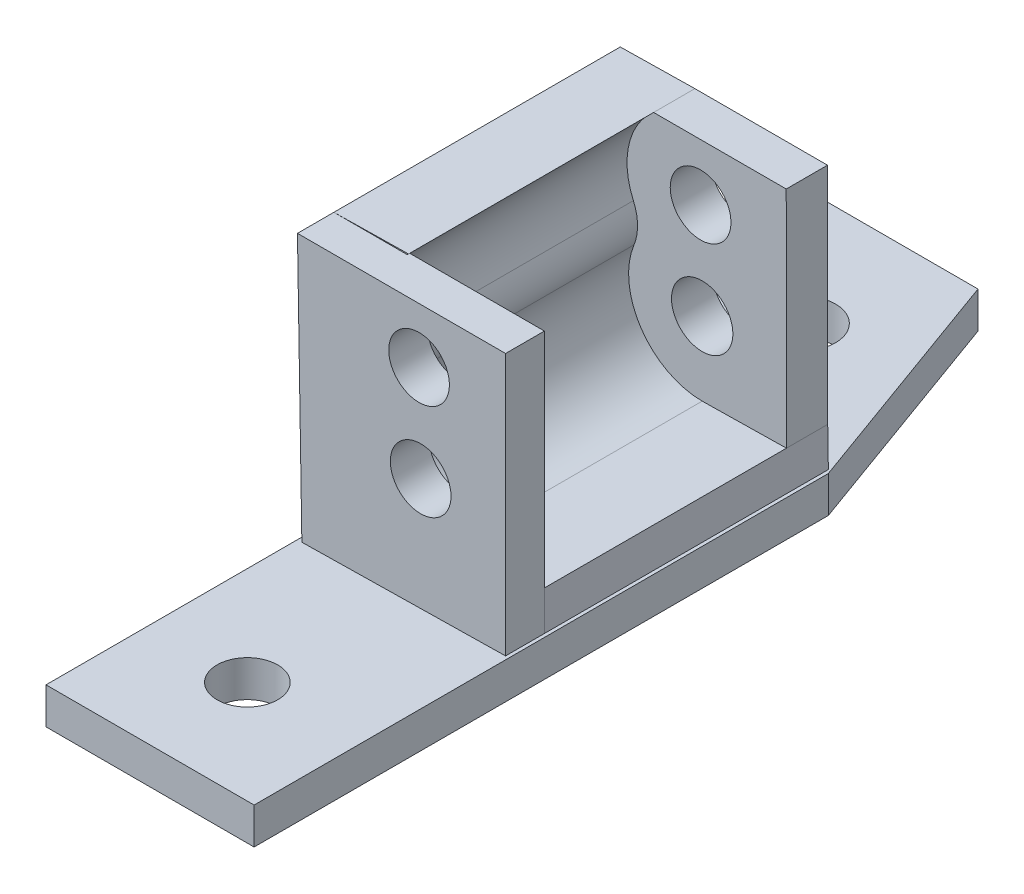
ISO-10303-21;
HEADER;
FILE_DESCRIPTION(('STEP AP214'),'2;1');
FILE_NAME('part.step','',(''),(''),'','','');
FILE_SCHEMA(('AUTOMOTIVE_DESIGN { 1 0 10303 214 1 1 1 1 }'));
ENDSEC;
DATA;
#1=APPLICATION_CONTEXT('core data for automotive mechanical design processes');
#2=APPLICATION_PROTOCOL_DEFINITION('international standard','automotive_design',2000,#1);
#3=PRODUCT_CONTEXT('',#1,'mechanical');
#4=PRODUCT('Part','Part','',(#3));
#5=PRODUCT_RELATED_PRODUCT_CATEGORY('part','',(#4));
#6=PRODUCT_DEFINITION_FORMATION('','',#4);
#7=PRODUCT_DEFINITION_CONTEXT('part definition',#1,'design');
#8=PRODUCT_DEFINITION('design','',#6,#7);
#9=PRODUCT_DEFINITION_SHAPE('','',#8);
#10=(LENGTH_UNIT() NAMED_UNIT(*) SI_UNIT(.MILLI.,.METRE.));
#11=(NAMED_UNIT(*) PLANE_ANGLE_UNIT() SI_UNIT($,.RADIAN.));
#12=(NAMED_UNIT(*) SI_UNIT($,.STERADIAN.) SOLID_ANGLE_UNIT());
#13=UNCERTAINTY_MEASURE_WITH_UNIT(LENGTH_MEASURE(1.E-05),#10,'distance_accuracy_value','');
#14=(GEOMETRIC_REPRESENTATION_CONTEXT(3) GLOBAL_UNCERTAINTY_ASSIGNED_CONTEXT((#13)) GLOBAL_UNIT_ASSIGNED_CONTEXT((#10,
#11,#12)) REPRESENTATION_CONTEXT('',''));
#15=CARTESIAN_POINT('',(0.,0.,0.));
#16=DIRECTION('',(0.,0.,1.));
#17=DIRECTION('',(1.,0.,0.));
#18=AXIS2_PLACEMENT_3D('',#15,#16,#17);
#19=CARTESIAN_POINT('',(-428.281622723484,104.714397362417,3.22006910734274E-13));
#20=DIRECTION('',(-0.999999992718876,0.00012067413737197,0.));
#21=DIRECTION('',(-0.00012067413737197,-0.999999992718876,0.));
#22=AXIS2_PLACEMENT_3D('',#19,#20,#21);
#23=PLANE('',#22);
#24=DIRECTION('',(0.,0.,1.));
#25=VECTOR('',#24,1.);
#26=CARTESIAN_POINT('',(-428.281162955021,108.524397334676,3.33536171392683E-13));
#27=LINE('',#26,#25);
#28=CARTESIAN_POINT('',(-428.281162955021,108.524397334676,-29.9720000000001));
#29=VERTEX_POINT('',#28);
#30=CARTESIAN_POINT('',(-428.281162955021,108.524397334676,30.1228889735027));
#31=VERTEX_POINT('',#30);
#32=EDGE_CURVE('E146',#29,#31,#27,.T.);
#33=ORIENTED_EDGE('',*,*,#32,.T.);
#34=DIRECTION('',(0.00012067413737197,0.999999992718876,0.));
#35=VECTOR('',#34,1.);
#36=CARTESIAN_POINT('',(-428.281622723484,104.714397362417,30.1228889735027));
#37=LINE('',#36,#35);
#38=CARTESIAN_POINT('',(-428.281622723484,104.714397362417,30.1228889735027));
#39=VERTEX_POINT('',#38);
#40=EDGE_CURVE('E12',#39,#31,#37,.T.);
#41=ORIENTED_EDGE('',*,*,#40,.F.);
#42=DIRECTION('',(0.,0.,1.));
#43=VECTOR('',#42,1.);
#44=CARTESIAN_POINT('',(-428.281622723484,104.714397362417,3.22006910734274E-13));
#45=LINE('',#44,#43);
#46=CARTESIAN_POINT('',(-428.281622723484,104.714397362417,-29.9720000000001));
#47=VERTEX_POINT('',#46);
#48=EDGE_CURVE('E168',#47,#39,#45,.T.);
#49=ORIENTED_EDGE('',*,*,#48,.F.);
#50=DIRECTION('',(0.00012067413737197,0.999999992718876,0.));
#51=VECTOR('',#50,1.);
#52=CARTESIAN_POINT('',(-428.281622723484,104.714397362417,-29.9720000000001));
#53=LINE('',#52,#51);
#54=EDGE_CURVE('E61',#47,#29,#53,.T.);
#55=ORIENTED_EDGE('',*,*,#54,.T.);
#56=EDGE_LOOP('',(#33,#41,#49,#55));
#57=FACE_BOUND('',#56,.T.);
#58=ADVANCED_FACE('F57',(#57),#23,.F.);
#59=CARTESIAN_POINT('',(0.0126300827371656,104.662713322542,30.1228889735027));
#60=DIRECTION('',(0.,0.,-1.));
#61=DIRECTION('',(0.,1.,0.));
#62=AXIS2_PLACEMENT_3D('',#59,#60,#61);
#63=PLANE('',#62);
#64=DIRECTION('',(-0.999999992718876,0.000120674137371941,0.));
#65=VECTOR('',#64,1.);
#66=CARTESIAN_POINT('',(0.0130898512005528,108.472713294801,30.1228889735027));
#67=LINE('',#66,#65);
#68=CARTESIAN_POINT('',(-450.061190391915,108.527025620718,30.1228889735027));
#69=VERTEX_POINT('',#68);
#70=EDGE_CURVE('E95',#31,#69,#67,.T.);
#71=ORIENTED_EDGE('',*,*,#70,.T.);
#72=DIRECTION('',(0.00012067413737197,0.999999992718876,0.));
#73=VECTOR('',#72,1.);
#74=CARTESIAN_POINT('',(-450.061650160379,104.717025648459,30.1228889735027));
#75=LINE('',#74,#73);
#76=CARTESIAN_POINT('',(-450.061650160379,104.717025648459,30.1228889735027));
#77=VERTEX_POINT('',#76);
#78=EDGE_CURVE('E67',#77,#69,#75,.T.);
#79=ORIENTED_EDGE('',*,*,#78,.F.);
#80=DIRECTION('',(-0.999999992718876,0.000120674137371941,0.));
#81=VECTOR('',#80,1.);
#82=CARTESIAN_POINT('',(0.0126300827371656,104.662713322542,30.1228889735027));
#83=LINE('',#82,#81);
#84=EDGE_CURVE('E75',#39,#77,#83,.T.);
#85=ORIENTED_EDGE('',*,*,#84,.F.);
#86=ORIENTED_EDGE('',*,*,#40,.T.);
#87=EDGE_LOOP('',(#71,#79,#85,#86));
#88=FACE_BOUND('',#87,.T.);
#89=ADVANCED_FACE('F185',(#88),#63,.F.);
#90=CARTESIAN_POINT('',(-450.061646900721,104.717025648066,3.22014468709933E-13));
#91=DIRECTION('',(0.999999992718876,-0.00012067413737197,0.));
#92=DIRECTION('',(0.00012067413737197,0.999999992718876,0.));
#93=AXIS2_PLACEMENT_3D('',#90,#91,#92);
#94=PLANE('',#93);
#95=DIRECTION('',(0.,0.,-1.));
#96=VECTOR('',#95,1.);
#97=CARTESIAN_POINT('',(-450.061187132257,108.527025620325,3.33543729368342E-13));
#98=LINE('',#97,#96);
#99=CARTESIAN_POINT('',(-450.061187132257,108.527025620325,-29.9720000000001));
#100=VERTEX_POINT('',#99);
#101=EDGE_CURVE('E126',#69,#100,#98,.T.);
#102=ORIENTED_EDGE('',*,*,#101,.T.);
#103=DIRECTION('',(0.00012067413737197,0.999999992718876,0.));
#104=VECTOR('',#103,1.);
#105=CARTESIAN_POINT('',(-450.061646900721,104.717025648066,-29.9720000000001));
#106=LINE('',#105,#104);
#107=CARTESIAN_POINT('',(-450.061646900721,104.717025648066,-29.9720000000001));
#108=VERTEX_POINT('',#107);
#109=EDGE_CURVE('E124',#108,#100,#106,.T.);
#110=ORIENTED_EDGE('',*,*,#109,.F.);
#111=DIRECTION('',(0.,0.,-1.));
#112=VECTOR('',#111,1.);
#113=CARTESIAN_POINT('',(-450.061646900721,104.717025648066,3.22014468709933E-13));
#114=LINE('',#113,#112);
#115=EDGE_CURVE('E115',#77,#108,#114,.T.);
#116=ORIENTED_EDGE('',*,*,#115,.F.);
#117=ORIENTED_EDGE('',*,*,#78,.T.);
#118=EDGE_LOOP('',(#102,#110,#116,#117));
#119=FACE_BOUND('',#118,.T.);
#120=ADVANCED_FACE('F125',(#119),#94,.F.);
#121=CARTESIAN_POINT('',(-374.739773483088,104.707936245899,153.690120750354));
#122=DIRECTION('',(0.92521581546426,-0.000111649621225839,-0.379441276549042));
#123=DIRECTION('',(-0.379441278914031,0.,-0.925215821230963));
#124=AXIS2_PLACEMENT_3D('',#121,#122,#123);
#125=PLANE('',#124);
#126=DIRECTION('',(-0.379441273786284,4.57887487337072E-05,-0.925215822200871));
#127=VECTOR('',#126,1.);
#128=CARTESIAN_POINT('',(-374.739313714625,108.517936218158,153.690120750354));
#129=LINE('',#128,#127);
#130=CARTESIAN_POINT('',(-460.129744076044,108.528240634758,-54.5228036017417));
#131=VERTEX_POINT('',#130);
#132=EDGE_CURVE('E153',#100,#131,#129,.T.);
#133=ORIENTED_EDGE('',*,*,#132,.T.);
#134=DIRECTION('',(0.00012067413737197,0.999999992718876,0.));
#135=VECTOR('',#134,1.);
#136=CARTESIAN_POINT('',(-460.130203844507,104.718240662499,-54.5228036017417));
#137=LINE('',#136,#135);
#138=CARTESIAN_POINT('',(-460.130203844507,104.718240662499,-54.5228036017417));
#139=VERTEX_POINT('',#138);
#140=EDGE_CURVE('E129',#139,#131,#137,.T.);
#141=ORIENTED_EDGE('',*,*,#140,.F.);
#142=DIRECTION('',(-0.379441273786284,4.57887487337072E-05,-0.925215822200871));
#143=VECTOR('',#142,1.);
#144=CARTESIAN_POINT('',(-374.739773483088,104.707936245899,153.690120750354));
#145=LINE('',#144,#143);
#146=EDGE_CURVE('E119',#108,#139,#145,.T.);
#147=ORIENTED_EDGE('',*,*,#146,.F.);
#148=ORIENTED_EDGE('',*,*,#109,.T.);
#149=EDGE_LOOP('',(#133,#141,#147,#148));
#150=FACE_BOUND('',#149,.T.);
#151=ADVANCED_FACE('F131',(#150),#125,.F.);
#152=CARTESIAN_POINT('',(0.0126300827371656,104.662713322542,-54.5228036017417));
#153=DIRECTION('',(0.,0.,1.));
#154=DIRECTION('',(0.,-1.,0.));
#155=AXIS2_PLACEMENT_3D('',#152,#153,#154);
#156=PLANE('',#155);
#157=DIRECTION('',(0.999999992718876,-0.000120674137371941,0.));
#158=VECTOR('',#157,1.);
#159=CARTESIAN_POINT('',(0.0130898512005528,108.472713294801,-54.5228036017417));
#160=LINE('',#159,#158);
#161=CARTESIAN_POINT('',(-437.167485423693,108.525469683983,-54.5228036017417));
#162=VERTEX_POINT('',#161);
#163=EDGE_CURVE('E151',#131,#162,#160,.T.);
#164=ORIENTED_EDGE('',*,*,#163,.T.);
#165=DIRECTION('',(0.00012067413737197,0.999999992718876,0.));
#166=VECTOR('',#165,1.);
#167=CARTESIAN_POINT('',(-437.167945192156,104.715469711724,-54.5228036017417));
#168=LINE('',#167,#166);
#169=CARTESIAN_POINT('',(-437.167945192156,104.715469711724,-54.5228036017417));
#170=VERTEX_POINT('',#169);
#171=EDGE_CURVE('E159',#170,#162,#168,.T.);
#172=ORIENTED_EDGE('',*,*,#171,.F.);
#173=DIRECTION('',(0.999999992718876,-0.000120674137371941,0.));
#174=VECTOR('',#173,1.);
#175=CARTESIAN_POINT('',(0.0126300827371656,104.662713322542,-54.5228036017417));
#176=LINE('',#175,#174);
#177=EDGE_CURVE('E134',#139,#170,#176,.T.);
#178=ORIENTED_EDGE('',*,*,#177,.F.);
#179=ORIENTED_EDGE('',*,*,#140,.T.);
#180=EDGE_LOOP('',(#164,#172,#178,#179));
#181=FACE_BOUND('',#180,.T.);
#182=ADVANCED_FACE('F191',(#181),#156,.F.);
#183=CARTESIAN_POINT('',(-443.274089103965,104.716206565378,-42.1855102646444));
#184=DIRECTION('',(0.00012067413737197,0.999999992718876,0.));
#185=DIRECTION('',(-0.999999992718876,0.00012067413737197,0.));
#186=AXIS2_PLACEMENT_3D('',#183,#184,#185);
#187=CYLINDRICAL_SURFACE('',#186,3.52301873978434);
#188=CARTESIAN_POINT('',(-443.274089103965,104.716206565378,-42.1855102646444));
#189=DIRECTION('',(0.000120674137371941,0.999999992718876,0.));
#190=DIRECTION('',(-0.999999992718876,0.000120674137371941,0.));
#191=AXIS2_PLACEMENT_3D('',#188,#189,#190);
#192=CIRCLE('',#191,3.52301873978434);
#193=CARTESIAN_POINT('',(-446.797107818098,104.716631702626,-42.1855102646444));
#194=VERTEX_POINT('',#193);
#195=EDGE_CURVE('E200',#194,#194,#192,.T.);
#196=ORIENTED_EDGE('',*,*,#195,.F.);
#197=EDGE_LOOP('',(#196));
#198=FACE_BOUND('',#197,.T.);
#199=CARTESIAN_POINT('',(-443.273629335502,108.526206537637,-42.1855102646443));
#200=DIRECTION('',(0.000120674137371941,0.999999992718876,0.));
#201=DIRECTION('',(-0.999999992718876,0.000120674137371941,0.));
#202=AXIS2_PLACEMENT_3D('',#199,#200,#201);
#203=CIRCLE('',#202,3.52301873978434);
#204=CARTESIAN_POINT('',(-446.796648049635,108.526631674885,-42.1855102646443));
#205=VERTEX_POINT('',#204);
#206=EDGE_CURVE('E143',#205,#205,#203,.T.);
#207=ORIENTED_EDGE('',*,*,#206,.T.);
#208=EDGE_LOOP('',(#207));
#209=FACE_BOUND('',#208,.T.);
#210=ADVANCED_FACE('F180',(#198,#209),#187,.F.);
#211=CARTESIAN_POINT('',(-439.751070389833,104.715781428131,19.359151608555));
#212=DIRECTION('',(0.00012067413737197,0.999999992718876,0.));
#213=DIRECTION('',(-0.999999992718876,0.00012067413737197,0.));
#214=AXIS2_PLACEMENT_3D('',#211,#212,#213);
#215=CYLINDRICAL_SURFACE('',#214,3.17128425727731);
#216=CARTESIAN_POINT('',(-439.751070389833,104.715781428131,19.359151608555));
#217=DIRECTION('',(0.000120674137371941,0.999999992718876,0.));
#218=DIRECTION('',(-0.999999992718876,0.000120674137371941,0.));
#219=AXIS2_PLACEMENT_3D('',#216,#217,#218);
#220=CIRCLE('',#219,3.17128425727731);
#221=CARTESIAN_POINT('',(-442.922354624019,104.716164120123,19.359151608555));
#222=VERTEX_POINT('',#221);
#223=EDGE_CURVE('E156',#222,#222,#220,.T.);
#224=ORIENTED_EDGE('',*,*,#223,.F.);
#225=EDGE_LOOP('',(#224));
#226=FACE_BOUND('',#225,.T.);
#227=CARTESIAN_POINT('',(-439.750610621369,108.52578140039,19.3591516085551));
#228=DIRECTION('',(0.000120674137371941,0.999999992718876,0.));
#229=DIRECTION('',(-0.999999992718876,0.000120674137371941,0.));
#230=AXIS2_PLACEMENT_3D('',#227,#228,#229);
#231=CIRCLE('',#230,3.17128425727731);
#232=CARTESIAN_POINT('',(-442.921894855556,108.526164092382,19.3591516085551));
#233=VERTEX_POINT('',#232);
#234=EDGE_CURVE('E140',#233,#233,#231,.T.);
#235=ORIENTED_EDGE('',*,*,#234,.T.);
#236=EDGE_LOOP('',(#235));
#237=FACE_BOUND('',#236,.T.);
#238=ADVANCED_FACE('F59',(#226,#237),#215,.F.);
#239=CARTESIAN_POINT('',(-369.077585434154,104.707252966236,133.594656199916));
#240=DIRECTION('',(-0.940299647078574,0.000113469849607533,0.340347705778225));
#241=DIRECTION('',(0.340347707969283,0.,0.940299653131945));
#242=AXIS2_PLACEMENT_3D('',#239,#240,#241);
#243=PLANE('',#242);
#244=DIRECTION('',(0.340347703300111,-4.10711658041963E-05,0.940299653925013));
#245=VECTOR('',#244,1.);
#246=CARTESIAN_POINT('',(-369.077125665691,108.517252938495,133.594656199916));
#247=LINE('',#246,#245);
#248=EDGE_CURVE('E149',#162,#29,#247,.T.);
#249=ORIENTED_EDGE('',*,*,#248,.T.);
#250=ORIENTED_EDGE('',*,*,#54,.F.);
#251=DIRECTION('',(0.340347703300111,-4.10711658041963E-05,0.940299653925013));
#252=VECTOR('',#251,1.);
#253=CARTESIAN_POINT('',(-369.077585434154,104.707252966236,133.594656199916));
#254=LINE('',#253,#252);
#255=EDGE_CURVE('E107',#170,#47,#254,.T.);
#256=ORIENTED_EDGE('',*,*,#255,.F.);
#257=ORIENTED_EDGE('',*,*,#171,.T.);
#258=EDGE_LOOP('',(#249,#250,#256,#257));
#259=FACE_BOUND('',#258,.T.);
#260=ADVANCED_FACE('F171',(#259),#243,.F.);
#261=CARTESIAN_POINT('',(0.0126300827371656,104.662713322542,3.21858286586235E-13));
#262=DIRECTION('',(0.000120674137371941,0.999999992718876,0.));
#263=DIRECTION('',(-0.999999992718876,0.000120674137371941,0.));
#264=AXIS2_PLACEMENT_3D('',#261,#262,#263);
#265=PLANE('',#264);
#266=ORIENTED_EDGE('',*,*,#223,.T.);
#267=EDGE_LOOP('',(#266));
#268=FACE_BOUND('',#267,.T.);
#269=ORIENTED_EDGE('',*,*,#195,.T.);
#270=EDGE_LOOP('',(#269));
#271=FACE_BOUND('',#270,.T.);
#272=ORIENTED_EDGE('',*,*,#48,.T.);
#273=ORIENTED_EDGE('',*,*,#84,.T.);
#274=ORIENTED_EDGE('',*,*,#115,.T.);
#275=ORIENTED_EDGE('',*,*,#146,.T.);
#276=ORIENTED_EDGE('',*,*,#177,.T.);
#277=ORIENTED_EDGE('',*,*,#255,.T.);
#278=EDGE_LOOP('',(#272,#273,#274,#275,#276,#277));
#279=FACE_BOUND('',#278,.T.);
#280=ADVANCED_FACE('F117',(#268,#271,#279),#265,.F.);
#281=CARTESIAN_POINT('',(0.0130898512005528,108.472713294801,3.33387547244644E-13));
#282=DIRECTION('',(0.000120674137371941,0.999999992718876,0.));
#283=DIRECTION('',(-0.999999992718876,0.000120674137371941,0.));
#284=AXIS2_PLACEMENT_3D('',#281,#282,#283);
#285=PLANE('',#284);
#286=ORIENTED_EDGE('',*,*,#234,.F.);
#287=EDGE_LOOP('',(#286));
#288=FACE_BOUND('',#287,.T.);
#289=ORIENTED_EDGE('',*,*,#206,.F.);
#290=EDGE_LOOP('',(#289));
#291=FACE_BOUND('',#290,.T.);
#292=ORIENTED_EDGE('',*,*,#32,.F.);
#293=ORIENTED_EDGE('',*,*,#248,.F.);
#294=ORIENTED_EDGE('',*,*,#163,.F.);
#295=ORIENTED_EDGE('',*,*,#132,.F.);
#296=ORIENTED_EDGE('',*,*,#101,.F.);
#297=ORIENTED_EDGE('',*,*,#70,.F.);
#298=EDGE_LOOP('',(#292,#293,#294,#295,#296,#297));
#299=FACE_BOUND('',#298,.T.);
#300=ADVANCED_FACE('F169',(#288,#291,#299),#285,.T.);
#301=CLOSED_SHELL('',(#58,#89,#120,#151,#182,#210,#238,#260,#280,#300));
#302=MANIFOLD_SOLID_BREP('B2',#301);
#303=CARTESIAN_POINT('',(-437.164813365978,120.500000000002,-29.972));
#304=DIRECTION('',(0.,0.,1.));
#305=DIRECTION('',(1.,0.,0.));
#306=AXIS2_PLACEMENT_3D('',#303,#304,#305);
#307=CYLINDRICAL_SURFACE('',#306,7.70069112138503);
#308=DIRECTION('',(0.,0.,1.));
#309=VECTOR('',#308,1.);
#310=CARTESIAN_POINT('',(-437.164813365978,112.799308878617,-29.972));
#311=LINE('',#310,#309);
#312=CARTESIAN_POINT('',(-437.164813365978,112.799308878617,-25.654));
#313=VERTEX_POINT('',#312);
#314=CARTESIAN_POINT('',(-437.164813365978,112.799308878617,-0.254000000000001));
#315=VERTEX_POINT('',#314);
#316=EDGE_CURVE('E298',#313,#315,#311,.T.);
#317=ORIENTED_EDGE('',*,*,#316,.F.);
#318=CARTESIAN_POINT('',(-437.164813365978,120.500000000002,-25.654));
#319=DIRECTION('',(0.,0.,-1.));
#320=DIRECTION('',(1.,0.,0.));
#321=AXIS2_PLACEMENT_3D('',#318,#319,#320);
#322=CIRCLE('',#321,7.70069112138503);
#323=CARTESIAN_POINT('',(-444.29982254805,123.396944548786,-25.654));
#324=VERTEX_POINT('',#323);
#325=EDGE_CURVE('E503',#313,#324,#322,.T.);
#326=ORIENTED_EDGE('',*,*,#325,.T.);
#327=DIRECTION('',(0.,0.,1.));
#328=VECTOR('',#327,1.);
#329=CARTESIAN_POINT('',(-444.29982254805,123.396944548786,-29.972));
#330=LINE('',#329,#328);
#331=CARTESIAN_POINT('',(-444.29982254805,123.396944548786,-0.254000000000001));
#332=VERTEX_POINT('',#331);
#333=EDGE_CURVE('E415',#324,#332,#330,.T.);
#334=ORIENTED_EDGE('',*,*,#333,.T.);
#335=CARTESIAN_POINT('',(-437.164813365978,120.500000000002,-0.254000000000001));
#336=DIRECTION('',(0.,0.,-1.));
#337=DIRECTION('',(-1.,0.,0.));
#338=AXIS2_PLACEMENT_3D('',#335,#336,#337);
#339=CIRCLE('',#338,7.70069112138503);
#340=EDGE_CURVE('E455',#332,#315,#339,.F.);
#341=ORIENTED_EDGE('',*,*,#340,.T.);
#342=EDGE_LOOP('',(#317,#326,#334,#341));
#343=FACE_BOUND('',#342,.T.);
#344=ADVANCED_FACE('F284',(#343),#307,.F.);
#345=CARTESIAN_POINT('',(-1.98065411762706,119.983223997919,-29.972));
#346=DIRECTION('',(0.016505509992304,-0.999863774791293,0.));
#347=DIRECTION('',(0.999863774791293,0.016505509992304,0.));
#348=AXIS2_PLACEMENT_3D('',#345,#346,#347);
#349=PLANE('',#348);
#350=DIRECTION('',(0.,0.,1.));
#351=VECTOR('',#350,1.);
#352=CARTESIAN_POINT('',(-428.345380430182,112.944897949966,-29.972));
#353=LINE('',#352,#351);
#354=CARTESIAN_POINT('',(-428.345380430182,112.944897949966,-25.654));
#355=VERTEX_POINT('',#354);
#356=CARTESIAN_POINT('',(-428.345380430182,112.944897949966,-0.254000000000001));
#357=VERTEX_POINT('',#356);
#358=EDGE_CURVE('E306',#355,#357,#353,.T.);
#359=ORIENTED_EDGE('',*,*,#358,.F.);
#360=DIRECTION('',(-0.999863774791293,-0.0165055099923026,0.));
#361=VECTOR('',#360,1.);
#362=CARTESIAN_POINT('',(-437.164813365978,112.799308878617,-25.654));
#363=LINE('',#362,#361);
#364=EDGE_CURVE('E506',#355,#313,#363,.T.);
#365=ORIENTED_EDGE('',*,*,#364,.T.);
#366=ORIENTED_EDGE('',*,*,#316,.T.);
#367=DIRECTION('',(0.999863774791293,0.016505509992304,0.));
#368=VECTOR('',#367,1.);
#369=CARTESIAN_POINT('',(-1.98065411762706,119.983223997919,-0.254000000000001));
#370=LINE('',#369,#368);
#371=EDGE_CURVE('E447',#315,#357,#370,.T.);
#372=ORIENTED_EDGE('',*,*,#371,.T.);
#373=EDGE_LOOP('',(#359,#365,#366,#372));
#374=FACE_BOUND('',#373,.T.);
#375=ADVANCED_FACE('F547',(#374),#349,.F.);
#376=CARTESIAN_POINT('',(-426.349391916702,-7.08953637968651,-29.972));
#377=DIRECTION('',(-0.999861775722981,-0.0166261675706364,0.));
#378=DIRECTION('',(0.0166261675706364,-0.999861775722981,0.));
#379=AXIS2_PLACEMENT_3D('',#376,#377,#378);
#380=PLANE('',#379);
#381=CARTESIAN_POINT('',(-428.345380430182,112.944897949966,-29.972));
#382=VERTEX_POINT('',#381);
#383=EDGE_CURVE('E425',#382,#355,#353,.T.);
#384=ORIENTED_EDGE('',*,*,#383,.T.);
#385=ORIENTED_EDGE('',*,*,#358,.T.);
#386=DIRECTION('',(0.0166261675706364,-0.999861775722981,0.));
#387=VECTOR('',#386,1.);
#388=CARTESIAN_POINT('',(-426.349391916702,-7.08953637968651,-0.254000000000001));
#389=LINE('',#388,#387);
#390=CARTESIAN_POINT('',(-428.277811685175,108.881459693428,-0.254000000000001));
#391=VERTEX_POINT('',#390);
#392=EDGE_CURVE('E446',#357,#391,#389,.T.);
#393=ORIENTED_EDGE('',*,*,#392,.T.);
#394=DIRECTION('',(0.,0.,1.));
#395=VECTOR('',#394,1.);
#396=CARTESIAN_POINT('',(-428.277811685175,108.881459693428,-29.972));
#397=LINE('',#396,#395);
#398=CARTESIAN_POINT('',(-428.277811685175,108.881459693428,-29.972));
#399=VERTEX_POINT('',#398);
#400=EDGE_CURVE('E431',#399,#391,#397,.T.);
#401=ORIENTED_EDGE('',*,*,#400,.F.);
#402=DIRECTION('',(0.0166261675706364,-0.999861775722981,0.));
#403=VECTOR('',#402,1.);
#404=CARTESIAN_POINT('',(-426.349391916702,-7.08953637968651,-29.972));
#405=LINE('',#404,#403);
#406=EDGE_CURVE('E420',#382,#399,#405,.T.);
#407=ORIENTED_EDGE('',*,*,#406,.F.);
#408=EDGE_LOOP('',(#384,#385,#393,#401,#407));
#409=FACE_BOUND('',#408,.T.);
#410=ADVANCED_FACE('F553',(#409),#380,.F.);
#411=CARTESIAN_POINT('',(-1.92841976847356,115.970996073115,-29.972));
#412=DIRECTION('',(-0.0166261675706368,0.999861775722981,0.));
#413=DIRECTION('',(-0.999861775722981,-0.0166261675706368,0.));
#414=AXIS2_PLACEMENT_3D('',#411,#412,#413);
#415=PLANE('',#414);
#416=ORIENTED_EDGE('',*,*,#400,.T.);
#417=DIRECTION('',(0.,0.,1.));
#418=VECTOR('',#417,1.);
#419=CARTESIAN_POINT('',(-428.277811685175,108.881459693428,-0.254000000000002));
#420=LINE('',#419,#418);
#421=CARTESIAN_POINT('',(-428.277811685175,108.881459693428,3.81));
#422=VERTEX_POINT('',#421);
#423=EDGE_CURVE('E464',#391,#422,#420,.T.);
#424=ORIENTED_EDGE('',*,*,#423,.T.);
#425=DIRECTION('',(0.999861775722981,0.0166261675706368,0.));
#426=VECTOR('',#425,1.);
#427=CARTESIAN_POINT('',(-449.596085913716,108.526969494636,3.81));
#428=LINE('',#427,#426);
#429=CARTESIAN_POINT('',(-449.596085913716,108.526969494636,3.81));
#430=VERTEX_POINT('',#429);
#431=EDGE_CURVE('E482',#430,#422,#428,.T.);
#432=ORIENTED_EDGE('',*,*,#431,.F.);
#433=DIRECTION('',(0.,0.,1.));
#434=VECTOR('',#433,1.);
#435=CARTESIAN_POINT('',(-449.596085913716,108.526969494636,-29.972));
#436=LINE('',#435,#434);
#437=CARTESIAN_POINT('',(-449.596085913716,108.526969494636,-29.972));
#438=VERTEX_POINT('',#437);
#439=EDGE_CURVE('E433',#438,#430,#436,.T.);
#440=ORIENTED_EDGE('',*,*,#439,.F.);
#441=DIRECTION('',(-0.999861775722981,-0.0166261675706368,0.));
#442=VECTOR('',#441,1.);
#443=CARTESIAN_POINT('',(-1.92841976847356,115.970996073115,-29.972));
#444=LINE('',#443,#442);
#445=EDGE_CURVE('E451',#399,#438,#444,.T.);
#446=ORIENTED_EDGE('',*,*,#445,.F.);
#447=EDGE_LOOP('',(#416,#424,#432,#440,#446));
#448=FACE_BOUND('',#447,.T.);
#449=ADVANCED_FACE('F573',(#448),#415,.F.);
#450=CARTESIAN_POINT('',(-447.667666145243,-7.44402657847845,-29.972));
#451=DIRECTION('',(-0.999861775722981,-0.0166261675706364,0.));
#452=DIRECTION('',(0.0166261675706364,-0.999861775722981,0.));
#453=AXIS2_PLACEMENT_3D('',#450,#451,#452);
#454=PLANE('',#453);
#455=ORIENTED_EDGE('',*,*,#439,.T.);
#456=DIRECTION('',(0.0166261675706364,-0.999861775722981,0.));
#457=VECTOR('',#456,1.);
#458=CARTESIAN_POINT('',(-450.057836179578,136.295632284974,3.81));
#459=LINE('',#458,#457);
#460=CARTESIAN_POINT('',(-450.057836179578,136.295632284974,3.81));
#461=VERTEX_POINT('',#460);
#462=EDGE_CURVE('E485',#461,#430,#459,.T.);
#463=ORIENTED_EDGE('',*,*,#462,.F.);
#464=DIRECTION('',(0.,0.,1.));
#465=VECTOR('',#464,1.);
#466=CARTESIAN_POINT('',(-450.057836179578,136.295632284974,-0.254000000000002));
#467=LINE('',#466,#465);
#468=CARTESIAN_POINT('',(-450.057836179578,136.295632284974,0.));
#469=VERTEX_POINT('',#468);
#470=EDGE_CURVE('E462',#469,#461,#467,.T.);
#471=ORIENTED_EDGE('',*,*,#470,.F.);
#472=DIRECTION('',(0.,0.,1.));
#473=VECTOR('',#472,1.);
#474=CARTESIAN_POINT('',(-450.057836179578,136.295632284974,-29.972));
#475=LINE('',#474,#473);
#476=CARTESIAN_POINT('',(-450.057836179578,136.295632284974,-29.972));
#477=VERTEX_POINT('',#476);
#478=EDGE_CURVE('E390',#477,#469,#475,.T.);
#479=ORIENTED_EDGE('',*,*,#478,.F.);
#480=DIRECTION('',(0.0166261675706364,-0.999861775722981,0.));
#481=VECTOR('',#480,1.);
#482=CARTESIAN_POINT('',(-447.667666145243,-7.44402657847845,-29.972));
#483=LINE('',#482,#481);
#484=EDGE_CURVE('E444',#477,#438,#483,.T.);
#485=ORIENTED_EDGE('',*,*,#484,.T.);
#486=EDGE_LOOP('',(#455,#463,#471,#479,#485));
#487=FACE_BOUND('',#486,.T.);
#488=ADVANCED_FACE('F571',(#487),#454,.T.);
#489=CARTESIAN_POINT('',(-2.39017003433478,143.739658863452,-29.972));
#490=DIRECTION('',(-0.0166261675706361,0.999861775722981,0.));
#491=DIRECTION('',(-0.999861775722981,-0.0166261675706361,0.));
#492=AXIS2_PLACEMENT_3D('',#489,#490,#491);
#493=PLANE('',#492);
#494=DIRECTION('',(-0.999861775722981,-0.0166261675706361,0.));
#495=VECTOR('',#494,1.);
#496=CARTESIAN_POINT('',(-2.39017003433478,143.739658863452,0.));
#497=LINE('',#496,#495);
#498=CARTESIAN_POINT('',(-442.244950430817,136.425548590231,0.));
#499=VERTEX_POINT('',#498);
#500=EDGE_CURVE('E414',#499,#469,#497,.T.);
#501=ORIENTED_EDGE('',*,*,#500,.F.);
#502=DIRECTION('',(0.,0.,1.));
#503=VECTOR('',#502,1.);
#504=CARTESIAN_POINT('',(-442.244950430817,136.425548590231,-29.972));
#505=LINE('',#504,#503);
#506=CARTESIAN_POINT('',(-442.244950430817,136.425548590231,-25.654));
#507=VERTEX_POINT('',#506);
#508=EDGE_CURVE('E391',#507,#499,#505,.T.);
#509=ORIENTED_EDGE('',*,*,#508,.F.);
#510=CARTESIAN_POINT('',(-442.244950430817,136.425548590231,-29.972));
#511=VERTEX_POINT('',#510);
#512=EDGE_CURVE('E380',#511,#507,#505,.T.);
#513=ORIENTED_EDGE('',*,*,#512,.F.);
#514=DIRECTION('',(-0.999861775722981,-0.0166261675706361,0.));
#515=VECTOR('',#514,1.);
#516=CARTESIAN_POINT('',(-2.39017003433478,143.739658863452,-29.972));
#517=LINE('',#516,#515);
#518=EDGE_CURVE('E439',#511,#477,#517,.T.);
#519=ORIENTED_EDGE('',*,*,#518,.T.);
#520=ORIENTED_EDGE('',*,*,#478,.T.);
#521=EDGE_LOOP('',(#501,#509,#513,#519,#520));
#522=FACE_BOUND('',#521,.T.);
#523=ADVANCED_FACE('F412',(#522),#493,.T.);
#524=CARTESIAN_POINT('',(-437.331098026262,130.500000000001,-29.972));
#525=DIRECTION('',(0.,0.,1.));
#526=DIRECTION('',(1.,0.,0.));
#527=AXIS2_PLACEMENT_3D('',#524,#525,#526);
#528=CYLINDRICAL_SURFACE('',#527,7.69792644475892);
#529=DIRECTION('',(0.,0.,1.));
#530=VECTOR('',#529,1.);
#531=CARTESIAN_POINT('',(-444.364912389817,127.372136983825,-29.972));
#532=LINE('',#531,#530);
#533=CARTESIAN_POINT('',(-444.364912389817,127.372136983825,-25.654));
#534=VERTEX_POINT('',#533);
#535=CARTESIAN_POINT('',(-444.364912389817,127.372136983825,-0.254000000000001));
#536=VERTEX_POINT('',#535);
#537=EDGE_CURVE('E408',#534,#536,#532,.T.);
#538=ORIENTED_EDGE('',*,*,#537,.F.);
#539=CARTESIAN_POINT('',(-437.331098026262,130.500000000001,-25.654));
#540=DIRECTION('',(0.,0.,-1.));
#541=DIRECTION('',(1.,0.,0.));
#542=AXIS2_PLACEMENT_3D('',#539,#540,#541);
#543=CIRCLE('',#542,7.69792644475882);
#544=EDGE_CURVE('E397',#534,#507,#543,.T.);
#545=ORIENTED_EDGE('',*,*,#544,.T.);
#546=ORIENTED_EDGE('',*,*,#508,.T.);
#547=CARTESIAN_POINT('',(-437.331098026262,130.500000000001,0.));
#548=DIRECTION('',(0.,0.,1.));
#549=DIRECTION('',(1.,0.,0.));
#550=AXIS2_PLACEMENT_3D('',#547,#548,#549);
#551=CIRCLE('',#550,7.69792644475892);
#552=CARTESIAN_POINT('',(-442.397528521818,136.295632284974,0.));
#553=VERTEX_POINT('',#552);
#554=EDGE_CURVE('E443',#499,#553,#551,.T.);
#555=ORIENTED_EDGE('',*,*,#554,.T.);
#556=DIRECTION('',(0.,0.,1.));
#557=VECTOR('',#556,1.);
#558=CARTESIAN_POINT('',(-442.397528521818,136.295632284974,-29.972));
#559=LINE('',#558,#557);
#560=CARTESIAN_POINT('',(-442.397528521818,136.295632284974,-0.254000000000001));
#561=VERTEX_POINT('',#560);
#562=EDGE_CURVE('E459',#553,#561,#559,.F.);
#563=ORIENTED_EDGE('',*,*,#562,.T.);
#564=CARTESIAN_POINT('',(-437.331098026262,130.500000000001,-0.254000000000001));
#565=DIRECTION('',(0.,0.,-1.));
#566=DIRECTION('',(-1.,0.,0.));
#567=AXIS2_PLACEMENT_3D('',#564,#565,#566);
#568=CIRCLE('',#567,7.69792644475892);
#569=EDGE_CURVE('E457',#561,#536,#568,.F.);
#570=ORIENTED_EDGE('',*,*,#569,.T.);
#571=EDGE_LOOP('',(#538,#545,#546,#555,#563,#570));
#572=FACE_BOUND('',#571,.T.);
#573=ADVANCED_FACE('F404',(#572),#528,.F.);
#574=CARTESIAN_POINT('',(-449.006652892701,125.30800396876,-29.972));
#575=DIRECTION('',(0.,0.,1.));
#576=DIRECTION('',(1.,0.,0.));
#577=AXIS2_PLACEMENT_3D('',#574,#575,#576);
#578=CYLINDRICAL_SURFACE('',#577,5.07999999999975);
#579=ORIENTED_EDGE('',*,*,#333,.F.);
#580=CARTESIAN_POINT('',(-449.006652892701,125.30800396876,-25.654));
#581=DIRECTION('',(0.,0.,1.));
#582=DIRECTION('',(-1.,0.,0.));
#583=AXIS2_PLACEMENT_3D('',#580,#581,#582);
#584=CIRCLE('',#583,5.0799999999997);
#585=EDGE_CURVE('E498',#324,#534,#584,.T.);
#586=ORIENTED_EDGE('',*,*,#585,.T.);
#587=ORIENTED_EDGE('',*,*,#537,.T.);
#588=CARTESIAN_POINT('',(-449.006652892701,125.30800396876,-0.254000000000001));
#589=DIRECTION('',(0.,0.,-1.));
#590=DIRECTION('',(-1.,0.,0.));
#591=AXIS2_PLACEMENT_3D('',#588,#589,#590);
#592=CIRCLE('',#591,5.07999999999975);
#593=EDGE_CURVE('E55',#536,#332,#592,.T.);
#594=ORIENTED_EDGE('',*,*,#593,.T.);
#595=EDGE_LOOP('',(#579,#586,#587,#594));
#596=FACE_BOUND('',#595,.T.);
#597=ADVANCED_FACE('F533',(#596),#578,.T.);
#598=CARTESIAN_POINT('',(0.,0.,-29.972));
#599=DIRECTION('',(0.,0.,1.));
#600=DIRECTION('',(1.,0.,0.));
#601=AXIS2_PLACEMENT_3D('',#598,#599,#600);
#602=PLANE('',#601);
#603=ORIENTED_EDGE('',*,*,#518,.F.);
#604=DIRECTION('',(1.,0.,0.));
#605=VECTOR('',#604,1.);
#606=CARTESIAN_POINT('',(-442.244950430817,136.425548590231,-29.972));
#607=LINE('',#606,#605);
#608=CARTESIAN_POINT('',(-428.367659486916,136.425548590231,-29.972));
#609=VERTEX_POINT('',#608);
#610=EDGE_CURVE('E385',#511,#609,#607,.T.);
#611=ORIENTED_EDGE('',*,*,#610,.T.);
#612=DIRECTION('',(0.000948825782001505,-0.999999549864716,0.));
#613=VECTOR('',#612,1.);
#614=CARTESIAN_POINT('',(-428.367659486916,136.425548590231,-29.972));
#615=LINE('',#614,#613);
#616=EDGE_CURVE('E409',#609,#382,#615,.T.);
#617=ORIENTED_EDGE('',*,*,#616,.T.);
#618=ORIENTED_EDGE('',*,*,#406,.T.);
#619=ORIENTED_EDGE('',*,*,#445,.T.);
#620=ORIENTED_EDGE('',*,*,#484,.F.);
#621=EDGE_LOOP('',(#603,#611,#617,#618,#619,#620));
#622=FACE_BOUND('',#621,.T.);
#623=CARTESIAN_POINT('',(-437.331098026262,130.500000000001,-29.972));
#624=DIRECTION('',(0.,0.,-1.));
#625=DIRECTION('',(-1.,0.,0.));
#626=AXIS2_PLACEMENT_3D('',#623,#624,#625);
#627=CIRCLE('',#626,3.177814596223);
#628=CARTESIAN_POINT('',(-440.508912622485,130.500000000001,-29.972));
#629=VERTEX_POINT('',#628);
#630=EDGE_CURVE('E515',#629,#629,#627,.T.);
#631=ORIENTED_EDGE('',*,*,#630,.F.);
#632=EDGE_LOOP('',(#631));
#633=FACE_BOUND('',#632,.T.);
#634=CARTESIAN_POINT('',(-437.164813365978,120.500000000002,-29.972));
#635=DIRECTION('',(0.,0.,-1.));
#636=DIRECTION('',(-1.,0.,0.));
#637=AXIS2_PLACEMENT_3D('',#634,#635,#636);
#638=CIRCLE('',#637,3.20878360493464);
#639=CARTESIAN_POINT('',(-440.373596970913,120.500000000002,-29.972));
#640=VERTEX_POINT('',#639);
#641=EDGE_CURVE('E509',#640,#640,#638,.T.);
#642=ORIENTED_EDGE('',*,*,#641,.F.);
#643=EDGE_LOOP('',(#642));
#644=FACE_BOUND('',#643,.T.);
#645=ADVANCED_FACE('F530',(#622,#633,#644),#602,.F.);
#646=CARTESIAN_POINT('',(0.,0.,0.));
#647=DIRECTION('',(0.,0.,1.));
#648=DIRECTION('',(1.,0.,0.));
#649=AXIS2_PLACEMENT_3D('',#646,#647,#648);
#650=PLANE('',#649);
#651=DIRECTION('',(-1.,0.,0.));
#652=VECTOR('',#651,1.);
#653=CARTESIAN_POINT('',(0.,136.295632284974,0.));
#654=LINE('',#653,#652);
#655=EDGE_CURVE('E291',#553,#469,#654,.T.);
#656=ORIENTED_EDGE('',*,*,#655,.F.);
#657=ORIENTED_EDGE('',*,*,#554,.F.);
#658=ORIENTED_EDGE('',*,*,#500,.T.);
#659=EDGE_LOOP('',(#656,#657,#658));
#660=FACE_BOUND('',#659,.T.);
#661=ADVANCED_FACE('F442',(#660),#650,.T.);
#662=CARTESIAN_POINT('',(-450.057836179578,136.295632284974,-0.254000000000002));
#663=DIRECTION('',(0.,1.,0.));
#664=DIRECTION('',(0.,0.,1.));
#665=AXIS2_PLACEMENT_3D('',#662,#663,#664);
#666=PLANE('',#665);
#667=ORIENTED_EDGE('',*,*,#562,.F.);
#668=ORIENTED_EDGE('',*,*,#655,.T.);
#669=ORIENTED_EDGE('',*,*,#470,.T.);
#670=DIRECTION('',(-1.,0.,0.));
#671=VECTOR('',#670,1.);
#672=CARTESIAN_POINT('',(-450.057836179578,136.295632284974,3.81));
#673=LINE('',#672,#671);
#674=CARTESIAN_POINT('',(-428.277811685175,136.295632284974,3.81));
#675=VERTEX_POINT('',#674);
#676=EDGE_CURVE('E487',#675,#461,#673,.T.);
#677=ORIENTED_EDGE('',*,*,#676,.F.);
#678=DIRECTION('',(0.,0.,1.));
#679=VECTOR('',#678,1.);
#680=CARTESIAN_POINT('',(-428.277811685175,136.295632284974,-0.254000000000002));
#681=LINE('',#680,#679);
#682=CARTESIAN_POINT('',(-428.277811685175,136.295632284974,-0.254000000000002));
#683=VERTEX_POINT('',#682);
#684=EDGE_CURVE('E461',#683,#675,#681,.T.);
#685=ORIENTED_EDGE('',*,*,#684,.F.);
#686=DIRECTION('',(-1.,0.,0.));
#687=VECTOR('',#686,1.);
#688=CARTESIAN_POINT('',(-450.057836179578,136.295632284974,-0.254000000000002));
#689=LINE('',#688,#687);
#690=EDGE_CURVE('E470',#683,#561,#689,.T.);
#691=ORIENTED_EDGE('',*,*,#690,.T.);
#692=EDGE_LOOP('',(#667,#668,#669,#677,#685,#691));
#693=FACE_BOUND('',#692,.T.);
#694=ADVANCED_FACE('F592',(#693),#666,.T.);
#695=CARTESIAN_POINT('',(-428.277811685175,136.295632284974,-0.254000000000002));
#696=DIRECTION('',(1.,0.,0.));
#697=DIRECTION('',(0.,0.,-1.));
#698=AXIS2_PLACEMENT_3D('',#695,#696,#697);
#699=PLANE('',#698);
#700=ORIENTED_EDGE('',*,*,#684,.T.);
#701=DIRECTION('',(0.,1.,0.));
#702=VECTOR('',#701,1.);
#703=CARTESIAN_POINT('',(-428.277811685175,136.295632284974,3.81));
#704=LINE('',#703,#702);
#705=EDGE_CURVE('E479',#422,#675,#704,.T.);
#706=ORIENTED_EDGE('',*,*,#705,.F.);
#707=ORIENTED_EDGE('',*,*,#423,.F.);
#708=DIRECTION('',(0.,1.,0.));
#709=VECTOR('',#708,1.);
#710=CARTESIAN_POINT('',(-428.277811685175,136.295632284974,-0.254000000000002));
#711=LINE('',#710,#709);
#712=EDGE_CURVE('E465',#391,#683,#711,.T.);
#713=ORIENTED_EDGE('',*,*,#712,.T.);
#714=EDGE_LOOP('',(#700,#706,#707,#713));
#715=FACE_BOUND('',#714,.T.);
#716=ADVANCED_FACE('F596',(#715),#699,.T.);
#717=CARTESIAN_POINT('',(0.,0.,-0.254000000000002));
#718=DIRECTION('',(0.,0.,-1.));
#719=DIRECTION('',(-1.,0.,0.));
#720=AXIS2_PLACEMENT_3D('',#717,#718,#719);
#721=PLANE('',#720);
#722=ORIENTED_EDGE('',*,*,#392,.F.);
#723=ORIENTED_EDGE('',*,*,#371,.F.);
#724=ORIENTED_EDGE('',*,*,#340,.F.);
#725=ORIENTED_EDGE('',*,*,#593,.F.);
#726=ORIENTED_EDGE('',*,*,#569,.F.);
#727=ORIENTED_EDGE('',*,*,#690,.F.);
#728=ORIENTED_EDGE('',*,*,#712,.F.);
#729=EDGE_LOOP('',(#722,#723,#724,#725,#726,#727,#728));
#730=FACE_BOUND('',#729,.T.);
#731=CARTESIAN_POINT('',(-437.331098026262,130.500000000001,-0.254000000000002));
#732=DIRECTION('',(0.,0.,1.));
#733=DIRECTION('',(1.,0.,0.));
#734=AXIS2_PLACEMENT_3D('',#731,#732,#733);
#735=CIRCLE('',#734,3.17500000000002);
#736=CARTESIAN_POINT('',(-434.156098026262,130.500000000001,-0.254000000000002));
#737=VERTEX_POINT('',#736);
#738=EDGE_CURVE('E476',#737,#737,#735,.T.);
#739=ORIENTED_EDGE('',*,*,#738,.T.);
#740=EDGE_LOOP('',(#739));
#741=FACE_BOUND('',#740,.T.);
#742=CARTESIAN_POINT('',(-437.164813365978,120.500000000001,-0.254000000000002));
#743=DIRECTION('',(0.,0.,1.));
#744=DIRECTION('',(1.,0.,0.));
#745=AXIS2_PLACEMENT_3D('',#742,#743,#744);
#746=CIRCLE('',#745,3.17500000000003);
#747=CARTESIAN_POINT('',(-433.989813365978,120.500000000001,-0.254000000000002));
#748=VERTEX_POINT('',#747);
#749=EDGE_CURVE('E473',#748,#748,#746,.T.);
#750=ORIENTED_EDGE('',*,*,#749,.T.);
#751=EDGE_LOOP('',(#750));
#752=FACE_BOUND('',#751,.T.);
#753=ADVANCED_FACE('F561',(#730,#741,#752),#721,.T.);
#754=CARTESIAN_POINT('',(-437.164813365978,120.500000000001,-0.254000000000002));
#755=DIRECTION('',(0.,0.,1.));
#756=DIRECTION('',(1.,0.,0.));
#757=AXIS2_PLACEMENT_3D('',#754,#755,#756);
#758=CYLINDRICAL_SURFACE('',#757,3.17500000000003);
#759=ORIENTED_EDGE('',*,*,#749,.F.);
#760=EDGE_LOOP('',(#759));
#761=FACE_BOUND('',#760,.T.);
#762=CARTESIAN_POINT('',(-437.164813365978,120.500000000001,3.81));
#763=DIRECTION('',(0.,0.,1.));
#764=DIRECTION('',(1.,0.,0.));
#765=AXIS2_PLACEMENT_3D('',#762,#763,#764);
#766=CIRCLE('',#765,3.17500000000003);
#767=CARTESIAN_POINT('',(-433.989813365978,120.500000000001,3.81));
#768=VERTEX_POINT('',#767);
#769=EDGE_CURVE('E490',#768,#768,#766,.T.);
#770=ORIENTED_EDGE('',*,*,#769,.T.);
#771=EDGE_LOOP('',(#770));
#772=FACE_BOUND('',#771,.T.);
#773=ADVANCED_FACE('F609',(#761,#772),#758,.F.);
#774=CARTESIAN_POINT('',(-437.331098026262,130.500000000001,-0.254000000000002));
#775=DIRECTION('',(0.,0.,1.));
#776=DIRECTION('',(1.,0.,0.));
#777=AXIS2_PLACEMENT_3D('',#774,#775,#776);
#778=CYLINDRICAL_SURFACE('',#777,3.17500000000002);
#779=ORIENTED_EDGE('',*,*,#738,.F.);
#780=EDGE_LOOP('',(#779));
#781=FACE_BOUND('',#780,.T.);
#782=CARTESIAN_POINT('',(-437.331098026262,130.500000000001,3.81));
#783=DIRECTION('',(0.,0.,1.));
#784=DIRECTION('',(1.,0.,0.));
#785=AXIS2_PLACEMENT_3D('',#782,#783,#784);
#786=CIRCLE('',#785,3.17500000000002);
#787=CARTESIAN_POINT('',(-434.156098026262,130.500000000001,3.81));
#788=VERTEX_POINT('',#787);
#789=EDGE_CURVE('E493',#788,#788,#786,.T.);
#790=ORIENTED_EDGE('',*,*,#789,.T.);
#791=EDGE_LOOP('',(#790));
#792=FACE_BOUND('',#791,.T.);
#793=ADVANCED_FACE('F602',(#781,#792),#778,.F.);
#794=CARTESIAN_POINT('',(0.,0.,3.81));
#795=DIRECTION('',(0.,0.,-1.));
#796=DIRECTION('',(-1.,0.,0.));
#797=AXIS2_PLACEMENT_3D('',#794,#795,#796);
#798=PLANE('',#797);
#799=ORIENTED_EDGE('',*,*,#676,.T.);
#800=ORIENTED_EDGE('',*,*,#462,.T.);
#801=ORIENTED_EDGE('',*,*,#431,.T.);
#802=ORIENTED_EDGE('',*,*,#705,.T.);
#803=EDGE_LOOP('',(#799,#800,#801,#802));
#804=FACE_BOUND('',#803,.T.);
#805=ORIENTED_EDGE('',*,*,#769,.F.);
#806=EDGE_LOOP('',(#805));
#807=FACE_BOUND('',#806,.T.);
#808=ORIENTED_EDGE('',*,*,#789,.F.);
#809=EDGE_LOOP('',(#808));
#810=FACE_BOUND('',#809,.T.);
#811=ADVANCED_FACE('F599',(#804,#807,#810),#798,.F.);
#812=CARTESIAN_POINT('',(-428.367659486916,136.425548590231,-25.654));
#813=DIRECTION('',(0.999999549864716,0.000948825782001505,0.));
#814=DIRECTION('',(-0.000948825782001505,0.999999549864716,0.));
#815=AXIS2_PLACEMENT_3D('',#812,#813,#814);
#816=PLANE('',#815);
#817=ORIENTED_EDGE('',*,*,#616,.F.);
#818=DIRECTION('',(0.,0.,-1.));
#819=VECTOR('',#818,1.);
#820=CARTESIAN_POINT('',(-428.367659486916,136.425548590231,-25.654));
#821=LINE('',#820,#819);
#822=CARTESIAN_POINT('',(-428.367659486916,136.425548590231,-25.654));
#823=VERTEX_POINT('',#822);
#824=EDGE_CURVE('E496',#823,#609,#821,.T.);
#825=ORIENTED_EDGE('',*,*,#824,.F.);
#826=DIRECTION('',(0.000948825782001505,-0.999999549864716,0.));
#827=VECTOR('',#826,1.);
#828=CARTESIAN_POINT('',(-428.367659486916,136.425548590231,-25.654));
#829=LINE('',#828,#827);
#830=EDGE_CURVE('E400',#823,#355,#829,.T.);
#831=ORIENTED_EDGE('',*,*,#830,.T.);
#832=ORIENTED_EDGE('',*,*,#383,.F.);
#833=EDGE_LOOP('',(#817,#825,#831,#832));
#834=FACE_BOUND('',#833,.T.);
#835=ADVANCED_FACE('F569',(#834),#816,.T.);
#836=CARTESIAN_POINT('',(-442.244950430817,136.425548590231,-25.654));
#837=DIRECTION('',(0.,1.,0.));
#838=DIRECTION('',(0.,0.,1.));
#839=AXIS2_PLACEMENT_3D('',#836,#837,#838);
#840=PLANE('',#839);
#841=ORIENTED_EDGE('',*,*,#610,.F.);
#842=ORIENTED_EDGE('',*,*,#512,.T.);
#843=DIRECTION('',(1.,0.,0.));
#844=VECTOR('',#843,1.);
#845=CARTESIAN_POINT('',(-442.244950430817,136.425548590231,-25.654));
#846=LINE('',#845,#844);
#847=EDGE_CURVE('E383',#507,#823,#846,.T.);
#848=ORIENTED_EDGE('',*,*,#847,.T.);
#849=ORIENTED_EDGE('',*,*,#824,.T.);
#850=EDGE_LOOP('',(#841,#842,#848,#849));
#851=FACE_BOUND('',#850,.T.);
#852=ADVANCED_FACE('F382',(#851),#840,.T.);
#853=CARTESIAN_POINT('',(-437.331098026262,130.500000000001,-25.654));
#854=DIRECTION('',(0.,0.,1.));
#855=DIRECTION('',(1.,0.,0.));
#856=AXIS2_PLACEMENT_3D('',#853,#854,#855);
#857=PLANE('',#856);
#858=CARTESIAN_POINT('',(-437.331098026262,130.500000000001,-25.654));
#859=DIRECTION('',(0.,0.,-1.));
#860=DIRECTION('',(-1.,0.,0.));
#861=AXIS2_PLACEMENT_3D('',#858,#859,#860);
#862=CIRCLE('',#861,3.177814596223);
#863=CARTESIAN_POINT('',(-440.508912622485,130.500000000001,-25.654));
#864=VERTEX_POINT('',#863);
#865=EDGE_CURVE('E512',#864,#864,#862,.T.);
#866=ORIENTED_EDGE('',*,*,#865,.T.);
#867=EDGE_LOOP('',(#866));
#868=FACE_BOUND('',#867,.T.);
#869=CARTESIAN_POINT('',(-437.164813365978,120.500000000002,-25.654));
#870=DIRECTION('',(0.,0.,-1.));
#871=DIRECTION('',(-1.,0.,0.));
#872=AXIS2_PLACEMENT_3D('',#869,#870,#871);
#873=CIRCLE('',#872,3.20878360493464);
#874=CARTESIAN_POINT('',(-440.373596970913,120.500000000002,-25.654));
#875=VERTEX_POINT('',#874);
#876=EDGE_CURVE('E501',#875,#875,#873,.T.);
#877=ORIENTED_EDGE('',*,*,#876,.T.);
#878=EDGE_LOOP('',(#877));
#879=FACE_BOUND('',#878,.T.);
#880=ORIENTED_EDGE('',*,*,#544,.F.);
#881=ORIENTED_EDGE('',*,*,#585,.F.);
#882=ORIENTED_EDGE('',*,*,#325,.F.);
#883=ORIENTED_EDGE('',*,*,#364,.F.);
#884=ORIENTED_EDGE('',*,*,#830,.F.);
#885=ORIENTED_EDGE('',*,*,#847,.F.);
#886=EDGE_LOOP('',(#880,#881,#882,#883,#884,#885));
#887=FACE_BOUND('',#886,.T.);
#888=ADVANCED_FACE('F396',(#868,#879,#887),#857,.T.);
#889=CARTESIAN_POINT('',(-437.164813365978,120.500000000002,-25.654));
#890=DIRECTION('',(0.,0.,-1.));
#891=DIRECTION('',(-1.,0.,0.));
#892=AXIS2_PLACEMENT_3D('',#889,#890,#891);
#893=CYLINDRICAL_SURFACE('',#892,3.20878360493464);
#894=ORIENTED_EDGE('',*,*,#876,.F.);
#895=EDGE_LOOP('',(#894));
#896=FACE_BOUND('',#895,.T.);
#897=ORIENTED_EDGE('',*,*,#641,.T.);
#898=EDGE_LOOP('',(#897));
#899=FACE_BOUND('',#898,.T.);
#900=ADVANCED_FACE('F526',(#896,#899),#893,.F.);
#901=CARTESIAN_POINT('',(-437.331098026262,130.500000000001,-25.654));
#902=DIRECTION('',(0.,0.,-1.));
#903=DIRECTION('',(-1.,0.,0.));
#904=AXIS2_PLACEMENT_3D('',#901,#902,#903);
#905=CYLINDRICAL_SURFACE('',#904,3.177814596223);
#906=ORIENTED_EDGE('',*,*,#865,.F.);
#907=EDGE_LOOP('',(#906));
#908=FACE_BOUND('',#907,.T.);
#909=ORIENTED_EDGE('',*,*,#630,.T.);
#910=EDGE_LOOP('',(#909));
#911=FACE_BOUND('',#910,.T.);
#912=ADVANCED_FACE('F523',(#908,#911),#905,.F.);
#913=CLOSED_SHELL('',(#344,#375,#410,#449,#488,#523,#573,#597,#645,#661,#694,#716,#753,#773,
#793,#811,#835,#852,#888,#900,#912));
#914=MANIFOLD_SOLID_BREP('B6',#913);
#915=ADVANCED_BREP_SHAPE_REPRESENTATION('',(#18,#302,#914),#14);
#916=SHAPE_DEFINITION_REPRESENTATION(#9,#915);
ENDSEC;
END-ISO-10303-21;
